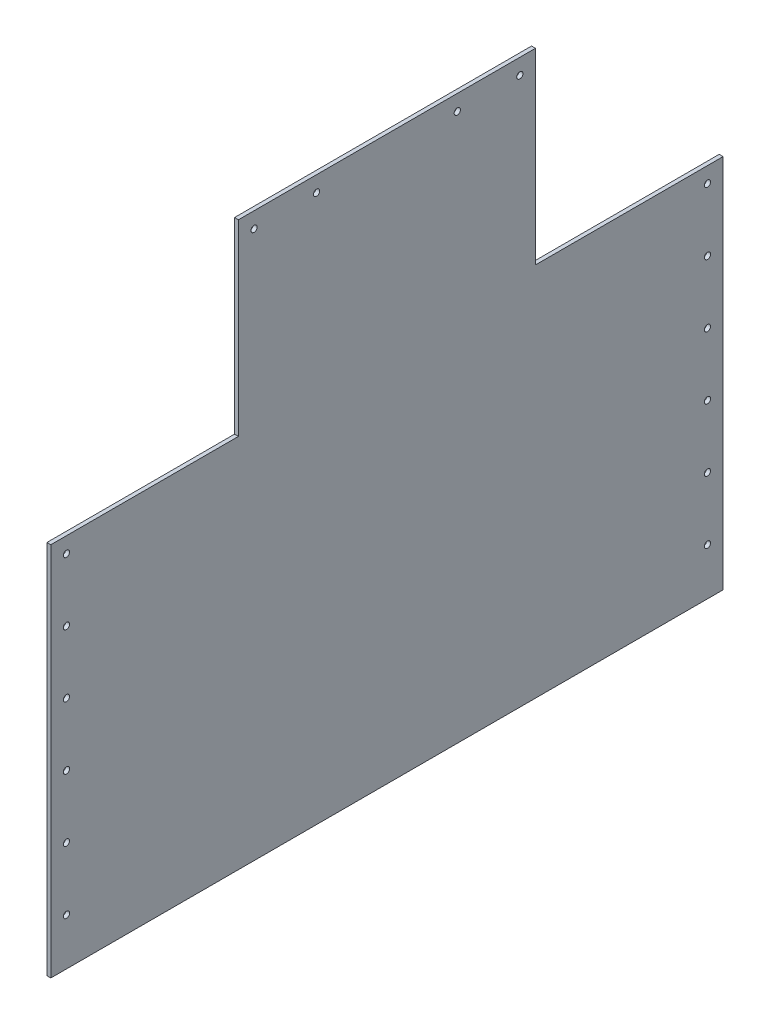
ISO-10303-21;
HEADER;
FILE_DESCRIPTION(('STEP AP214'),'2;1');
FILE_NAME('part.step','',(''),(''),'','','');
FILE_SCHEMA(('AUTOMOTIVE_DESIGN { 1 0 10303 214 1 1 1 1 }'));
ENDSEC;
DATA;
#1=APPLICATION_CONTEXT('core data for automotive mechanical design processes');
#2=APPLICATION_PROTOCOL_DEFINITION('international standard','automotive_design',2000,#1);
#3=PRODUCT_CONTEXT('',#1,'mechanical');
#4=PRODUCT('Part','Part','',(#3));
#5=PRODUCT_RELATED_PRODUCT_CATEGORY('part','',(#4));
#6=PRODUCT_DEFINITION_FORMATION('','',#4);
#7=PRODUCT_DEFINITION_CONTEXT('part definition',#1,'design');
#8=PRODUCT_DEFINITION('design','',#6,#7);
#9=PRODUCT_DEFINITION_SHAPE('','',#8);
#10=(LENGTH_UNIT() NAMED_UNIT(*) SI_UNIT(.MILLI.,.METRE.));
#11=(NAMED_UNIT(*) PLANE_ANGLE_UNIT() SI_UNIT($,.RADIAN.));
#12=(NAMED_UNIT(*) SI_UNIT($,.STERADIAN.) SOLID_ANGLE_UNIT());
#13=UNCERTAINTY_MEASURE_WITH_UNIT(LENGTH_MEASURE(1.E-05),#10,'distance_accuracy_value','');
#14=(GEOMETRIC_REPRESENTATION_CONTEXT(3) GLOBAL_UNCERTAINTY_ASSIGNED_CONTEXT((#13)) GLOBAL_UNIT_ASSIGNED_CONTEXT((#10,
#11,#12)) REPRESENTATION_CONTEXT('',''));
#15=CARTESIAN_POINT('',(0.,0.,0.));
#16=DIRECTION('',(0.,0.,1.));
#17=DIRECTION('',(1.,0.,0.));
#18=AXIS2_PLACEMENT_3D('',#15,#16,#17);
#19=CARTESIAN_POINT('',(3.175,0.,-546.1));
#20=DIRECTION('',(0.,1.,0.));
#21=DIRECTION('',(0.,0.,1.));
#22=AXIS2_PLACEMENT_3D('',#19,#20,#21);
#23=PLANE('',#22);
#24=DIRECTION('',(0.,0.,-1.));
#25=VECTOR('',#24,1.);
#26=CARTESIAN_POINT('',(0.,0.,-546.1));
#27=LINE('',#26,#25);
#28=CARTESIAN_POINT('',(0.,0.,0.));
#29=VERTEX_POINT('',#28);
#30=CARTESIAN_POINT('',(0.,0.,-546.1));
#31=VERTEX_POINT('',#30);
#32=EDGE_CURVE('E128',#29,#31,#27,.T.);
#33=ORIENTED_EDGE('',*,*,#32,.T.);
#34=DIRECTION('',(-1.,0.,0.));
#35=VECTOR('',#34,1.);
#36=CARTESIAN_POINT('',(3.175,0.,-546.1));
#37=LINE('',#36,#35);
#38=CARTESIAN_POINT('',(3.175,0.,-546.1));
#39=VERTEX_POINT('',#38);
#40=EDGE_CURVE('E11',#39,#31,#37,.T.);
#41=ORIENTED_EDGE('',*,*,#40,.F.);
#42=DIRECTION('',(0.,0.,-1.));
#43=VECTOR('',#42,1.);
#44=CARTESIAN_POINT('',(3.175,0.,-546.1));
#45=LINE('',#44,#43);
#46=CARTESIAN_POINT('',(3.175,0.,0.));
#47=VERTEX_POINT('',#46);
#48=EDGE_CURVE('E130',#47,#39,#45,.T.);
#49=ORIENTED_EDGE('',*,*,#48,.F.);
#50=DIRECTION('',(-1.,0.,0.));
#51=VECTOR('',#50,1.);
#52=CARTESIAN_POINT('',(3.175,0.,0.));
#53=LINE('',#52,#51);
#54=EDGE_CURVE('E47',#47,#29,#53,.T.);
#55=ORIENTED_EDGE('',*,*,#54,.T.);
#56=EDGE_LOOP('',(#33,#41,#49,#55));
#57=FACE_BOUND('',#56,.T.);
#58=ADVANCED_FACE('F39',(#57),#23,.F.);
#59=CARTESIAN_POINT('',(3.175,457.2,-546.1));
#60=DIRECTION('',(0.,0.,1.));
#61=DIRECTION('',(0.,-1.,0.));
#62=AXIS2_PLACEMENT_3D('',#59,#60,#61);
#63=PLANE('',#62);
#64=DIRECTION('',(0.,1.,0.));
#65=VECTOR('',#64,1.);
#66=CARTESIAN_POINT('',(0.,457.2,-546.1));
#67=LINE('',#66,#65);
#68=CARTESIAN_POINT('',(0.,304.8,-546.1));
#69=VERTEX_POINT('',#68);
#70=EDGE_CURVE('E139',#31,#69,#67,.T.);
#71=ORIENTED_EDGE('',*,*,#70,.T.);
#72=DIRECTION('',(1.,0.,0.));
#73=VECTOR('',#72,1.);
#74=CARTESIAN_POINT('',(0.,304.8,-546.1));
#75=LINE('',#74,#73);
#76=CARTESIAN_POINT('',(3.175,304.8,-546.1));
#77=VERTEX_POINT('',#76);
#78=EDGE_CURVE('E161',#69,#77,#75,.T.);
#79=ORIENTED_EDGE('',*,*,#78,.T.);
#80=DIRECTION('',(0.,1.,0.));
#81=VECTOR('',#80,1.);
#82=CARTESIAN_POINT('',(3.175,457.2,-546.1));
#83=LINE('',#82,#81);
#84=EDGE_CURVE('E136',#39,#77,#83,.T.);
#85=ORIENTED_EDGE('',*,*,#84,.F.);
#86=ORIENTED_EDGE('',*,*,#40,.T.);
#87=EDGE_LOOP('',(#71,#79,#85,#86));
#88=FACE_BOUND('',#87,.T.);
#89=ADVANCED_FACE('F160',(#88),#63,.F.);
#90=CARTESIAN_POINT('',(3.175,457.2,0.));
#91=DIRECTION('',(0.,-1.,0.));
#92=DIRECTION('',(0.,0.,-1.));
#93=AXIS2_PLACEMENT_3D('',#90,#91,#92);
#94=PLANE('',#93);
#95=DIRECTION('',(0.,0.,1.));
#96=VECTOR('',#95,1.);
#97=CARTESIAN_POINT('',(0.,457.2,0.));
#98=LINE('',#97,#96);
#99=CARTESIAN_POINT('',(0.,457.2,-393.7));
#100=VERTEX_POINT('',#99);
#101=CARTESIAN_POINT('',(0.,457.2,-152.4));
#102=VERTEX_POINT('',#101);
#103=EDGE_CURVE('E131',#100,#102,#98,.T.);
#104=ORIENTED_EDGE('',*,*,#103,.T.);
#105=DIRECTION('',(1.,0.,0.));
#106=VECTOR('',#105,1.);
#107=CARTESIAN_POINT('',(0.,457.2,-152.4));
#108=LINE('',#107,#106);
#109=CARTESIAN_POINT('',(3.175,457.2,-152.4));
#110=VERTEX_POINT('',#109);
#111=EDGE_CURVE('E221',#102,#110,#108,.T.);
#112=ORIENTED_EDGE('',*,*,#111,.T.);
#113=DIRECTION('',(0.,0.,1.));
#114=VECTOR('',#113,1.);
#115=CARTESIAN_POINT('',(3.175,457.2,0.));
#116=LINE('',#115,#114);
#117=CARTESIAN_POINT('',(3.175,457.2,-393.7));
#118=VERTEX_POINT('',#117);
#119=EDGE_CURVE('E146',#118,#110,#116,.T.);
#120=ORIENTED_EDGE('',*,*,#119,.F.);
#121=DIRECTION('',(1.,0.,0.));
#122=VECTOR('',#121,1.);
#123=CARTESIAN_POINT('',(0.,457.2,-393.7));
#124=LINE('',#123,#122);
#125=EDGE_CURVE('E168',#100,#118,#124,.T.);
#126=ORIENTED_EDGE('',*,*,#125,.F.);
#127=EDGE_LOOP('',(#104,#112,#120,#126));
#128=FACE_BOUND('',#127,.T.);
#129=ADVANCED_FACE('F323',(#128),#94,.F.);
#130=CARTESIAN_POINT('',(3.175,0.,0.));
#131=DIRECTION('',(0.,0.,-1.));
#132=DIRECTION('',(-1.,0.,0.));
#133=AXIS2_PLACEMENT_3D('',#130,#131,#132);
#134=PLANE('',#133);
#135=DIRECTION('',(0.,-1.,0.));
#136=VECTOR('',#135,1.);
#137=CARTESIAN_POINT('',(3.175,0.,0.));
#138=LINE('',#137,#136);
#139=CARTESIAN_POINT('',(3.175,304.8,0.));
#140=VERTEX_POINT('',#139);
#141=EDGE_CURVE('E121',#140,#47,#138,.T.);
#142=ORIENTED_EDGE('',*,*,#141,.F.);
#143=DIRECTION('',(1.,0.,0.));
#144=VECTOR('',#143,1.);
#145=CARTESIAN_POINT('',(0.,304.8,0.));
#146=LINE('',#145,#144);
#147=CARTESIAN_POINT('',(0.,304.8,0.));
#148=VERTEX_POINT('',#147);
#149=EDGE_CURVE('E107',#148,#140,#146,.T.);
#150=ORIENTED_EDGE('',*,*,#149,.F.);
#151=DIRECTION('',(0.,-1.,0.));
#152=VECTOR('',#151,1.);
#153=CARTESIAN_POINT('',(0.,0.,0.));
#154=LINE('',#153,#152);
#155=EDGE_CURVE('E119',#148,#29,#154,.T.);
#156=ORIENTED_EDGE('',*,*,#155,.T.);
#157=ORIENTED_EDGE('',*,*,#54,.F.);
#158=EDGE_LOOP('',(#142,#150,#156,#157));
#159=FACE_BOUND('',#158,.T.);
#160=ADVANCED_FACE('F117',(#159),#134,.F.);
#161=CARTESIAN_POINT('',(3.175,0.,0.));
#162=DIRECTION('',(-1.,0.,0.));
#163=DIRECTION('',(0.,0.,1.));
#164=AXIS2_PLACEMENT_3D('',#161,#162,#163);
#165=PLANE('',#164);
#166=CARTESIAN_POINT('',(3.175,444.5,-165.1));
#167=DIRECTION('',(1.,0.,0.));
#168=DIRECTION('',(0.,0.,-1.));
#169=AXIS2_PLACEMENT_3D('',#166,#167,#168);
#170=CIRCLE('',#169,2.54000000000001);
#171=CARTESIAN_POINT('',(3.175,444.5,-167.64));
#172=VERTEX_POINT('',#171);
#173=EDGE_CURVE('E225',#172,#172,#170,.T.);
#174=ORIENTED_EDGE('',*,*,#173,.F.);
#175=EDGE_LOOP('',(#174));
#176=FACE_BOUND('',#175,.T.);
#177=CARTESIAN_POINT('',(3.175,444.5,-215.9));
#178=DIRECTION('',(1.,0.,0.));
#179=DIRECTION('',(0.,0.,-1.));
#180=AXIS2_PLACEMENT_3D('',#177,#178,#179);
#181=CIRCLE('',#180,2.54000000000001);
#182=CARTESIAN_POINT('',(3.175,444.5,-218.44));
#183=VERTEX_POINT('',#182);
#184=EDGE_CURVE('E233',#183,#183,#181,.T.);
#185=ORIENTED_EDGE('',*,*,#184,.F.);
#186=EDGE_LOOP('',(#185));
#187=FACE_BOUND('',#186,.T.);
#188=CARTESIAN_POINT('',(3.175,292.1,-12.7));
#189=DIRECTION('',(1.,0.,0.));
#190=DIRECTION('',(0.,0.,-1.));
#191=AXIS2_PLACEMENT_3D('',#188,#189,#190);
#192=CIRCLE('',#191,2.54000000000001);
#193=CARTESIAN_POINT('',(3.175,292.1,-15.24));
#194=VERTEX_POINT('',#193);
#195=EDGE_CURVE('E241',#194,#194,#192,.T.);
#196=ORIENTED_EDGE('',*,*,#195,.F.);
#197=EDGE_LOOP('',(#196));
#198=FACE_BOUND('',#197,.T.);
#199=CARTESIAN_POINT('',(3.175,241.3,-12.7));
#200=DIRECTION('',(1.,0.,0.));
#201=DIRECTION('',(0.,0.,-1.));
#202=AXIS2_PLACEMENT_3D('',#199,#200,#201);
#203=CIRCLE('',#202,2.54000000000001);
#204=CARTESIAN_POINT('',(3.175,241.3,-15.24));
#205=VERTEX_POINT('',#204);
#206=EDGE_CURVE('E249',#205,#205,#203,.T.);
#207=ORIENTED_EDGE('',*,*,#206,.F.);
#208=EDGE_LOOP('',(#207));
#209=FACE_BOUND('',#208,.T.);
#210=CARTESIAN_POINT('',(3.175,190.5,-12.7));
#211=DIRECTION('',(1.,0.,0.));
#212=DIRECTION('',(0.,0.,-1.));
#213=AXIS2_PLACEMENT_3D('',#210,#211,#212);
#214=CIRCLE('',#213,2.54000000000001);
#215=CARTESIAN_POINT('',(3.175,190.5,-15.24));
#216=VERTEX_POINT('',#215);
#217=EDGE_CURVE('E257',#216,#216,#214,.T.);
#218=ORIENTED_EDGE('',*,*,#217,.F.);
#219=EDGE_LOOP('',(#218));
#220=FACE_BOUND('',#219,.T.);
#221=CARTESIAN_POINT('',(3.175,139.7,-12.7));
#222=DIRECTION('',(1.,0.,0.));
#223=DIRECTION('',(0.,0.,-1.));
#224=AXIS2_PLACEMENT_3D('',#221,#222,#223);
#225=CIRCLE('',#224,2.54000000000001);
#226=CARTESIAN_POINT('',(3.175,139.7,-15.24));
#227=VERTEX_POINT('',#226);
#228=EDGE_CURVE('E265',#227,#227,#225,.T.);
#229=ORIENTED_EDGE('',*,*,#228,.F.);
#230=EDGE_LOOP('',(#229));
#231=FACE_BOUND('',#230,.T.);
#232=CARTESIAN_POINT('',(3.175,88.9,-12.7));
#233=DIRECTION('',(1.,0.,0.));
#234=DIRECTION('',(0.,0.,-1.));
#235=AXIS2_PLACEMENT_3D('',#232,#233,#234);
#236=CIRCLE('',#235,2.54000000000001);
#237=CARTESIAN_POINT('',(3.175,88.9,-15.24));
#238=VERTEX_POINT('',#237);
#239=EDGE_CURVE('E273',#238,#238,#236,.T.);
#240=ORIENTED_EDGE('',*,*,#239,.F.);
#241=EDGE_LOOP('',(#240));
#242=FACE_BOUND('',#241,.T.);
#243=CARTESIAN_POINT('',(3.175,38.1,-12.7));
#244=DIRECTION('',(1.,0.,0.));
#245=DIRECTION('',(0.,0.,-1.));
#246=AXIS2_PLACEMENT_3D('',#243,#244,#245);
#247=CIRCLE('',#246,2.54000000000001);
#248=CARTESIAN_POINT('',(3.175,38.1,-15.24));
#249=VERTEX_POINT('',#248);
#250=EDGE_CURVE('E281',#249,#249,#247,.T.);
#251=ORIENTED_EDGE('',*,*,#250,.F.);
#252=EDGE_LOOP('',(#251));
#253=FACE_BOUND('',#252,.T.);
#254=CARTESIAN_POINT('',(3.175,38.1000000000004,-533.4));
#255=DIRECTION('',(1.,0.,0.));
#256=DIRECTION('',(0.,0.,1.));
#257=AXIS2_PLACEMENT_3D('',#254,#255,#256);
#258=CIRCLE('',#257,2.54000000000006);
#259=CARTESIAN_POINT('',(3.175,38.1000000000004,-530.86));
#260=VERTEX_POINT('',#259);
#261=EDGE_CURVE('E289',#260,#260,#258,.T.);
#262=ORIENTED_EDGE('',*,*,#261,.F.);
#263=EDGE_LOOP('',(#262));
#264=FACE_BOUND('',#263,.T.);
#265=CARTESIAN_POINT('',(3.175,88.9000000000004,-533.4));
#266=DIRECTION('',(1.,0.,0.));
#267=DIRECTION('',(0.,0.,1.));
#268=AXIS2_PLACEMENT_3D('',#265,#266,#267);
#269=CIRCLE('',#268,2.54000000000006);
#270=CARTESIAN_POINT('',(3.175,88.9000000000004,-530.86));
#271=VERTEX_POINT('',#270);
#272=EDGE_CURVE('E297',#271,#271,#269,.T.);
#273=ORIENTED_EDGE('',*,*,#272,.F.);
#274=EDGE_LOOP('',(#273));
#275=FACE_BOUND('',#274,.T.);
#276=CARTESIAN_POINT('',(3.175,139.7,-533.4));
#277=DIRECTION('',(1.,0.,0.));
#278=DIRECTION('',(0.,0.,1.));
#279=AXIS2_PLACEMENT_3D('',#276,#277,#278);
#280=CIRCLE('',#279,2.54000000000006);
#281=CARTESIAN_POINT('',(3.175,139.7,-530.86));
#282=VERTEX_POINT('',#281);
#283=EDGE_CURVE('E305',#282,#282,#280,.T.);
#284=ORIENTED_EDGE('',*,*,#283,.F.);
#285=EDGE_LOOP('',(#284));
#286=FACE_BOUND('',#285,.T.);
#287=CARTESIAN_POINT('',(3.175,190.5,-533.4));
#288=DIRECTION('',(1.,0.,0.));
#289=DIRECTION('',(0.,0.,1.));
#290=AXIS2_PLACEMENT_3D('',#287,#288,#289);
#291=CIRCLE('',#290,2.54000000000006);
#292=CARTESIAN_POINT('',(3.175,190.5,-530.86));
#293=VERTEX_POINT('',#292);
#294=EDGE_CURVE('E192',#293,#293,#291,.T.);
#295=ORIENTED_EDGE('',*,*,#294,.F.);
#296=EDGE_LOOP('',(#295));
#297=FACE_BOUND('',#296,.T.);
#298=CARTESIAN_POINT('',(3.175,444.5,-381.));
#299=DIRECTION('',(1.,0.,0.));
#300=DIRECTION('',(0.,0.,1.));
#301=AXIS2_PLACEMENT_3D('',#298,#299,#300);
#302=CIRCLE('',#301,2.54000000000001);
#303=CARTESIAN_POINT('',(3.175,444.5,-378.46));
#304=VERTEX_POINT('',#303);
#305=EDGE_CURVE('E217',#304,#304,#302,.T.);
#306=ORIENTED_EDGE('',*,*,#305,.F.);
#307=EDGE_LOOP('',(#306));
#308=FACE_BOUND('',#307,.T.);
#309=CARTESIAN_POINT('',(3.175,444.5,-330.2));
#310=DIRECTION('',(1.,0.,0.));
#311=DIRECTION('',(0.,0.,1.));
#312=AXIS2_PLACEMENT_3D('',#309,#310,#311);
#313=CIRCLE('',#312,2.54000000000001);
#314=CARTESIAN_POINT('',(3.175,444.5,-327.66));
#315=VERTEX_POINT('',#314);
#316=EDGE_CURVE('E209',#315,#315,#313,.T.);
#317=ORIENTED_EDGE('',*,*,#316,.F.);
#318=EDGE_LOOP('',(#317));
#319=FACE_BOUND('',#318,.T.);
#320=CARTESIAN_POINT('',(3.175,292.1,-533.4));
#321=DIRECTION('',(1.,0.,0.));
#322=DIRECTION('',(0.,0.,1.));
#323=AXIS2_PLACEMENT_3D('',#320,#321,#322);
#324=CIRCLE('',#323,2.54000000000006);
#325=CARTESIAN_POINT('',(3.175,292.1,-530.86));
#326=VERTEX_POINT('',#325);
#327=EDGE_CURVE('E201',#326,#326,#324,.T.);
#328=ORIENTED_EDGE('',*,*,#327,.F.);
#329=EDGE_LOOP('',(#328));
#330=FACE_BOUND('',#329,.T.);
#331=CARTESIAN_POINT('',(3.175,241.3,-533.4));
#332=DIRECTION('',(1.,0.,0.));
#333=DIRECTION('',(0.,0.,1.));
#334=AXIS2_PLACEMENT_3D('',#331,#332,#333);
#335=CIRCLE('',#334,2.54000000000006);
#336=CARTESIAN_POINT('',(3.175,241.3,-530.86));
#337=VERTEX_POINT('',#336);
#338=EDGE_CURVE('E193',#337,#337,#335,.T.);
#339=ORIENTED_EDGE('',*,*,#338,.F.);
#340=EDGE_LOOP('',(#339));
#341=FACE_BOUND('',#340,.T.);
#342=ORIENTED_EDGE('',*,*,#119,.T.);
#343=DIRECTION('',(0.,1.,0.));
#344=VECTOR('',#343,1.);
#345=CARTESIAN_POINT('',(3.175,457.2,-152.4));
#346=LINE('',#345,#344);
#347=CARTESIAN_POINT('',(3.175,304.8,-152.4));
#348=VERTEX_POINT('',#347);
#349=EDGE_CURVE('E113',#348,#110,#346,.T.);
#350=ORIENTED_EDGE('',*,*,#349,.F.);
#351=DIRECTION('',(0.,0.,-1.));
#352=VECTOR('',#351,1.);
#353=CARTESIAN_POINT('',(3.175,304.8,0.));
#354=LINE('',#353,#352);
#355=EDGE_CURVE('E185',#140,#348,#354,.T.);
#356=ORIENTED_EDGE('',*,*,#355,.F.);
#357=ORIENTED_EDGE('',*,*,#141,.T.);
#358=ORIENTED_EDGE('',*,*,#48,.T.);
#359=ORIENTED_EDGE('',*,*,#84,.T.);
#360=DIRECTION('',(0.,0.,-1.));
#361=VECTOR('',#360,1.);
#362=CARTESIAN_POINT('',(3.175,304.8,-546.1));
#363=LINE('',#362,#361);
#364=CARTESIAN_POINT('',(3.175,304.8,-393.7));
#365=VERTEX_POINT('',#364);
#366=EDGE_CURVE('E174',#365,#77,#363,.T.);
#367=ORIENTED_EDGE('',*,*,#366,.F.);
#368=DIRECTION('',(0.,-1.,0.));
#369=VECTOR('',#368,1.);
#370=CARTESIAN_POINT('',(3.175,457.2,-393.7));
#371=LINE('',#370,#369);
#372=EDGE_CURVE('E177',#118,#365,#371,.T.);
#373=ORIENTED_EDGE('',*,*,#372,.F.);
#374=EDGE_LOOP('',(#342,#350,#356,#357,#358,#359,#367,#373));
#375=FACE_BOUND('',#374,.T.);
#376=ADVANCED_FACE('F317',(#176,#187,#198,#209,#220,#231,#242,#253,#264,#275,#286,#297,#308,
#319,#330,#341,#375),#165,.F.);
#377=CARTESIAN_POINT('',(0.,0.,0.));
#378=DIRECTION('',(-1.,0.,0.));
#379=DIRECTION('',(0.,0.,1.));
#380=AXIS2_PLACEMENT_3D('',#377,#378,#379);
#381=PLANE('',#380);
#382=DIRECTION('',(0.,1.,0.));
#383=VECTOR('',#382,1.);
#384=CARTESIAN_POINT('',(0.,457.2,-152.4));
#385=LINE('',#384,#383);
#386=CARTESIAN_POINT('',(0.,304.8,-152.4));
#387=VERTEX_POINT('',#386);
#388=EDGE_CURVE('E54',#387,#102,#385,.T.);
#389=ORIENTED_EDGE('',*,*,#388,.T.);
#390=ORIENTED_EDGE('',*,*,#103,.F.);
#391=DIRECTION('',(0.,-1.,0.));
#392=VECTOR('',#391,1.);
#393=CARTESIAN_POINT('',(0.,457.2,-393.7));
#394=LINE('',#393,#392);
#395=CARTESIAN_POINT('',(0.,304.8,-393.7));
#396=VERTEX_POINT('',#395);
#397=EDGE_CURVE('E166',#100,#396,#394,.T.);
#398=ORIENTED_EDGE('',*,*,#397,.T.);
#399=DIRECTION('',(0.,0.,-1.));
#400=VECTOR('',#399,1.);
#401=CARTESIAN_POINT('',(0.,304.8,-546.1));
#402=LINE('',#401,#400);
#403=EDGE_CURVE('E62',#396,#69,#402,.T.);
#404=ORIENTED_EDGE('',*,*,#403,.T.);
#405=ORIENTED_EDGE('',*,*,#70,.F.);
#406=ORIENTED_EDGE('',*,*,#32,.F.);
#407=ORIENTED_EDGE('',*,*,#155,.F.);
#408=DIRECTION('',(0.,0.,-1.));
#409=VECTOR('',#408,1.);
#410=CARTESIAN_POINT('',(0.,304.8,0.));
#411=LINE('',#410,#409);
#412=EDGE_CURVE('E103',#148,#387,#411,.T.);
#413=ORIENTED_EDGE('',*,*,#412,.T.);
#414=EDGE_LOOP('',(#389,#390,#398,#404,#405,#406,#407,#413));
#415=FACE_BOUND('',#414,.T.);
#416=CARTESIAN_POINT('',(0.,444.5,-165.1));
#417=DIRECTION('',(1.,0.,0.));
#418=DIRECTION('',(0.,0.,-1.));
#419=AXIS2_PLACEMENT_3D('',#416,#417,#418);
#420=CIRCLE('',#419,2.54000000000001);
#421=CARTESIAN_POINT('',(0.,444.5,-167.64));
#422=VERTEX_POINT('',#421);
#423=EDGE_CURVE('E155',#422,#422,#420,.T.);
#424=ORIENTED_EDGE('',*,*,#423,.T.);
#425=EDGE_LOOP('',(#424));
#426=FACE_BOUND('',#425,.T.);
#427=CARTESIAN_POINT('',(0.,444.5,-215.9));
#428=DIRECTION('',(1.,0.,0.));
#429=DIRECTION('',(0.,0.,-1.));
#430=AXIS2_PLACEMENT_3D('',#427,#428,#429);
#431=CIRCLE('',#430,2.54000000000001);
#432=CARTESIAN_POINT('',(0.,444.5,-218.44));
#433=VERTEX_POINT('',#432);
#434=EDGE_CURVE('E229',#433,#433,#431,.T.);
#435=ORIENTED_EDGE('',*,*,#434,.T.);
#436=EDGE_LOOP('',(#435));
#437=FACE_BOUND('',#436,.T.);
#438=CARTESIAN_POINT('',(0.,292.1,-12.7));
#439=DIRECTION('',(1.,0.,0.));
#440=DIRECTION('',(0.,0.,-1.));
#441=AXIS2_PLACEMENT_3D('',#438,#439,#440);
#442=CIRCLE('',#441,2.54000000000001);
#443=CARTESIAN_POINT('',(0.,292.1,-15.24));
#444=VERTEX_POINT('',#443);
#445=EDGE_CURVE('E237',#444,#444,#442,.T.);
#446=ORIENTED_EDGE('',*,*,#445,.T.);
#447=EDGE_LOOP('',(#446));
#448=FACE_BOUND('',#447,.T.);
#449=CARTESIAN_POINT('',(0.,241.3,-12.7));
#450=DIRECTION('',(1.,0.,0.));
#451=DIRECTION('',(0.,0.,-1.));
#452=AXIS2_PLACEMENT_3D('',#449,#450,#451);
#453=CIRCLE('',#452,2.54000000000001);
#454=CARTESIAN_POINT('',(0.,241.3,-15.24));
#455=VERTEX_POINT('',#454);
#456=EDGE_CURVE('E245',#455,#455,#453,.T.);
#457=ORIENTED_EDGE('',*,*,#456,.T.);
#458=EDGE_LOOP('',(#457));
#459=FACE_BOUND('',#458,.T.);
#460=CARTESIAN_POINT('',(0.,190.5,-12.7));
#461=DIRECTION('',(1.,0.,0.));
#462=DIRECTION('',(0.,0.,-1.));
#463=AXIS2_PLACEMENT_3D('',#460,#461,#462);
#464=CIRCLE('',#463,2.54000000000001);
#465=CARTESIAN_POINT('',(0.,190.5,-15.24));
#466=VERTEX_POINT('',#465);
#467=EDGE_CURVE('E253',#466,#466,#464,.T.);
#468=ORIENTED_EDGE('',*,*,#467,.T.);
#469=EDGE_LOOP('',(#468));
#470=FACE_BOUND('',#469,.T.);
#471=CARTESIAN_POINT('',(0.,139.7,-12.7));
#472=DIRECTION('',(1.,0.,0.));
#473=DIRECTION('',(0.,0.,-1.));
#474=AXIS2_PLACEMENT_3D('',#471,#472,#473);
#475=CIRCLE('',#474,2.54000000000001);
#476=CARTESIAN_POINT('',(0.,139.7,-15.24));
#477=VERTEX_POINT('',#476);
#478=EDGE_CURVE('E261',#477,#477,#475,.T.);
#479=ORIENTED_EDGE('',*,*,#478,.T.);
#480=EDGE_LOOP('',(#479));
#481=FACE_BOUND('',#480,.T.);
#482=CARTESIAN_POINT('',(0.,88.9,-12.7));
#483=DIRECTION('',(1.,0.,0.));
#484=DIRECTION('',(0.,0.,-1.));
#485=AXIS2_PLACEMENT_3D('',#482,#483,#484);
#486=CIRCLE('',#485,2.54000000000001);
#487=CARTESIAN_POINT('',(0.,88.9,-15.24));
#488=VERTEX_POINT('',#487);
#489=EDGE_CURVE('E269',#488,#488,#486,.T.);
#490=ORIENTED_EDGE('',*,*,#489,.T.);
#491=EDGE_LOOP('',(#490));
#492=FACE_BOUND('',#491,.T.);
#493=CARTESIAN_POINT('',(0.,38.1,-12.7));
#494=DIRECTION('',(1.,0.,0.));
#495=DIRECTION('',(0.,0.,-1.));
#496=AXIS2_PLACEMENT_3D('',#493,#494,#495);
#497=CIRCLE('',#496,2.54000000000001);
#498=CARTESIAN_POINT('',(0.,38.1,-15.24));
#499=VERTEX_POINT('',#498);
#500=EDGE_CURVE('E277',#499,#499,#497,.T.);
#501=ORIENTED_EDGE('',*,*,#500,.T.);
#502=EDGE_LOOP('',(#501));
#503=FACE_BOUND('',#502,.T.);
#504=CARTESIAN_POINT('',(0.,38.1000000000004,-533.4));
#505=DIRECTION('',(1.,0.,0.));
#506=DIRECTION('',(0.,0.,1.));
#507=AXIS2_PLACEMENT_3D('',#504,#505,#506);
#508=CIRCLE('',#507,2.54000000000006);
#509=CARTESIAN_POINT('',(0.,38.1000000000004,-530.86));
#510=VERTEX_POINT('',#509);
#511=EDGE_CURVE('E285',#510,#510,#508,.T.);
#512=ORIENTED_EDGE('',*,*,#511,.T.);
#513=EDGE_LOOP('',(#512));
#514=FACE_BOUND('',#513,.T.);
#515=CARTESIAN_POINT('',(0.,88.9000000000004,-533.4));
#516=DIRECTION('',(1.,0.,0.));
#517=DIRECTION('',(0.,0.,1.));
#518=AXIS2_PLACEMENT_3D('',#515,#516,#517);
#519=CIRCLE('',#518,2.54000000000006);
#520=CARTESIAN_POINT('',(0.,88.9000000000004,-530.86));
#521=VERTEX_POINT('',#520);
#522=EDGE_CURVE('E293',#521,#521,#519,.T.);
#523=ORIENTED_EDGE('',*,*,#522,.T.);
#524=EDGE_LOOP('',(#523));
#525=FACE_BOUND('',#524,.T.);
#526=CARTESIAN_POINT('',(0.,139.7,-533.4));
#527=DIRECTION('',(1.,0.,0.));
#528=DIRECTION('',(0.,0.,1.));
#529=AXIS2_PLACEMENT_3D('',#526,#527,#528);
#530=CIRCLE('',#529,2.54000000000006);
#531=CARTESIAN_POINT('',(0.,139.7,-530.86));
#532=VERTEX_POINT('',#531);
#533=EDGE_CURVE('E301',#532,#532,#530,.T.);
#534=ORIENTED_EDGE('',*,*,#533,.T.);
#535=EDGE_LOOP('',(#534));
#536=FACE_BOUND('',#535,.T.);
#537=CARTESIAN_POINT('',(0.,190.5,-533.4));
#538=DIRECTION('',(1.,0.,0.));
#539=DIRECTION('',(0.,0.,1.));
#540=AXIS2_PLACEMENT_3D('',#537,#538,#539);
#541=CIRCLE('',#540,2.54000000000006);
#542=CARTESIAN_POINT('',(0.,190.5,-530.86));
#543=VERTEX_POINT('',#542);
#544=EDGE_CURVE('E309',#543,#543,#541,.T.);
#545=ORIENTED_EDGE('',*,*,#544,.T.);
#546=EDGE_LOOP('',(#545));
#547=FACE_BOUND('',#546,.T.);
#548=CARTESIAN_POINT('',(0.,444.5,-381.));
#549=DIRECTION('',(1.,0.,0.));
#550=DIRECTION('',(0.,0.,1.));
#551=AXIS2_PLACEMENT_3D('',#548,#549,#550);
#552=CIRCLE('',#551,2.54000000000001);
#553=CARTESIAN_POINT('',(0.,444.5,-378.46));
#554=VERTEX_POINT('',#553);
#555=EDGE_CURVE('E213',#554,#554,#552,.T.);
#556=ORIENTED_EDGE('',*,*,#555,.T.);
#557=EDGE_LOOP('',(#556));
#558=FACE_BOUND('',#557,.T.);
#559=CARTESIAN_POINT('',(0.,444.5,-330.2));
#560=DIRECTION('',(1.,0.,0.));
#561=DIRECTION('',(0.,0.,1.));
#562=AXIS2_PLACEMENT_3D('',#559,#560,#561);
#563=CIRCLE('',#562,2.54000000000001);
#564=CARTESIAN_POINT('',(0.,444.5,-327.66));
#565=VERTEX_POINT('',#564);
#566=EDGE_CURVE('E205',#565,#565,#563,.T.);
#567=ORIENTED_EDGE('',*,*,#566,.T.);
#568=EDGE_LOOP('',(#567));
#569=FACE_BOUND('',#568,.T.);
#570=CARTESIAN_POINT('',(0.,292.1,-533.4));
#571=DIRECTION('',(1.,0.,0.));
#572=DIRECTION('',(0.,0.,1.));
#573=AXIS2_PLACEMENT_3D('',#570,#571,#572);
#574=CIRCLE('',#573,2.54000000000006);
#575=CARTESIAN_POINT('',(0.,292.1,-530.86));
#576=VERTEX_POINT('',#575);
#577=EDGE_CURVE('E197',#576,#576,#574,.T.);
#578=ORIENTED_EDGE('',*,*,#577,.T.);
#579=EDGE_LOOP('',(#578));
#580=FACE_BOUND('',#579,.T.);
#581=CARTESIAN_POINT('',(0.,241.3,-533.4));
#582=DIRECTION('',(1.,0.,0.));
#583=DIRECTION('',(0.,0.,1.));
#584=AXIS2_PLACEMENT_3D('',#581,#582,#583);
#585=CIRCLE('',#584,2.54000000000006);
#586=CARTESIAN_POINT('',(0.,241.3,-530.86));
#587=VERTEX_POINT('',#586);
#588=EDGE_CURVE('E188',#587,#587,#585,.T.);
#589=ORIENTED_EDGE('',*,*,#588,.T.);
#590=EDGE_LOOP('',(#589));
#591=FACE_BOUND('',#590,.T.);
#592=ADVANCED_FACE('F125',(#415,#426,#437,#448,#459,#470,#481,#492,#503,#514,#525,#536,#547,
#558,#569,#580,#591),#381,.T.);
#593=CARTESIAN_POINT('',(0.,241.3,-533.4));
#594=DIRECTION('',(1.,0.,0.));
#595=DIRECTION('',(0.,0.,-1.));
#596=AXIS2_PLACEMENT_3D('',#593,#594,#595);
#597=CYLINDRICAL_SURFACE('',#596,2.54000000000006);
#598=ORIENTED_EDGE('',*,*,#588,.F.);
#599=EDGE_LOOP('',(#598));
#600=FACE_BOUND('',#599,.T.);
#601=ORIENTED_EDGE('',*,*,#338,.T.);
#602=EDGE_LOOP('',(#601));
#603=FACE_BOUND('',#602,.T.);
#604=ADVANCED_FACE('F334',(#600,#603),#597,.F.);
#605=CARTESIAN_POINT('',(0.,292.1,-533.4));
#606=DIRECTION('',(1.,0.,0.));
#607=DIRECTION('',(0.,0.,-1.));
#608=AXIS2_PLACEMENT_3D('',#605,#606,#607);
#609=CYLINDRICAL_SURFACE('',#608,2.54000000000006);
#610=ORIENTED_EDGE('',*,*,#577,.F.);
#611=EDGE_LOOP('',(#610));
#612=FACE_BOUND('',#611,.T.);
#613=ORIENTED_EDGE('',*,*,#327,.T.);
#614=EDGE_LOOP('',(#613));
#615=FACE_BOUND('',#614,.T.);
#616=ADVANCED_FACE('F394',(#612,#615),#609,.F.);
#617=CARTESIAN_POINT('',(0.,444.5,-330.2));
#618=DIRECTION('',(1.,0.,0.));
#619=DIRECTION('',(0.,0.,-1.));
#620=AXIS2_PLACEMENT_3D('',#617,#618,#619);
#621=CYLINDRICAL_SURFACE('',#620,2.54000000000001);
#622=ORIENTED_EDGE('',*,*,#566,.F.);
#623=EDGE_LOOP('',(#622));
#624=FACE_BOUND('',#623,.T.);
#625=ORIENTED_EDGE('',*,*,#316,.T.);
#626=EDGE_LOOP('',(#625));
#627=FACE_BOUND('',#626,.T.);
#628=ADVANCED_FACE('F390',(#624,#627),#621,.F.);
#629=CARTESIAN_POINT('',(0.,444.5,-381.));
#630=DIRECTION('',(1.,0.,0.));
#631=DIRECTION('',(0.,0.,-1.));
#632=AXIS2_PLACEMENT_3D('',#629,#630,#631);
#633=CYLINDRICAL_SURFACE('',#632,2.54000000000001);
#634=ORIENTED_EDGE('',*,*,#555,.F.);
#635=EDGE_LOOP('',(#634));
#636=FACE_BOUND('',#635,.T.);
#637=ORIENTED_EDGE('',*,*,#305,.T.);
#638=EDGE_LOOP('',(#637));
#639=FACE_BOUND('',#638,.T.);
#640=ADVANCED_FACE('F342',(#636,#639),#633,.F.);
#641=CARTESIAN_POINT('',(0.,190.5,-533.4));
#642=DIRECTION('',(1.,0.,0.));
#643=DIRECTION('',(0.,0.,-1.));
#644=AXIS2_PLACEMENT_3D('',#641,#642,#643);
#645=CYLINDRICAL_SURFACE('',#644,2.54000000000006);
#646=ORIENTED_EDGE('',*,*,#544,.F.);
#647=EDGE_LOOP('',(#646));
#648=FACE_BOUND('',#647,.T.);
#649=ORIENTED_EDGE('',*,*,#294,.T.);
#650=EDGE_LOOP('',(#649));
#651=FACE_BOUND('',#650,.T.);
#652=ADVANCED_FACE('F338',(#648,#651),#645,.F.);
#653=CARTESIAN_POINT('',(0.,139.7,-533.4));
#654=DIRECTION('',(1.,0.,0.));
#655=DIRECTION('',(0.,0.,-1.));
#656=AXIS2_PLACEMENT_3D('',#653,#654,#655);
#657=CYLINDRICAL_SURFACE('',#656,2.54000000000006);
#658=ORIENTED_EDGE('',*,*,#533,.F.);
#659=EDGE_LOOP('',(#658));
#660=FACE_BOUND('',#659,.T.);
#661=ORIENTED_EDGE('',*,*,#283,.T.);
#662=EDGE_LOOP('',(#661));
#663=FACE_BOUND('',#662,.T.);
#664=ADVANCED_FACE('F341',(#660,#663),#657,.F.);
#665=CARTESIAN_POINT('',(0.,88.9000000000004,-533.4));
#666=DIRECTION('',(1.,0.,0.));
#667=DIRECTION('',(0.,0.,-1.));
#668=AXIS2_PLACEMENT_3D('',#665,#666,#667);
#669=CYLINDRICAL_SURFACE('',#668,2.54000000000006);
#670=ORIENTED_EDGE('',*,*,#522,.F.);
#671=EDGE_LOOP('',(#670));
#672=FACE_BOUND('',#671,.T.);
#673=ORIENTED_EDGE('',*,*,#272,.T.);
#674=EDGE_LOOP('',(#673));
#675=FACE_BOUND('',#674,.T.);
#676=ADVANCED_FACE('F346',(#672,#675),#669,.F.);
#677=CARTESIAN_POINT('',(0.,38.1000000000004,-533.4));
#678=DIRECTION('',(1.,0.,0.));
#679=DIRECTION('',(0.,0.,-1.));
#680=AXIS2_PLACEMENT_3D('',#677,#678,#679);
#681=CYLINDRICAL_SURFACE('',#680,2.54000000000006);
#682=ORIENTED_EDGE('',*,*,#511,.F.);
#683=EDGE_LOOP('',(#682));
#684=FACE_BOUND('',#683,.T.);
#685=ORIENTED_EDGE('',*,*,#261,.T.);
#686=EDGE_LOOP('',(#685));
#687=FACE_BOUND('',#686,.T.);
#688=ADVANCED_FACE('F350',(#684,#687),#681,.F.);
#689=CARTESIAN_POINT('',(0.,38.1,-12.7));
#690=DIRECTION('',(1.,0.,0.));
#691=DIRECTION('',(0.,0.,-1.));
#692=AXIS2_PLACEMENT_3D('',#689,#690,#691);
#693=CYLINDRICAL_SURFACE('',#692,2.54000000000001);
#694=ORIENTED_EDGE('',*,*,#500,.F.);
#695=EDGE_LOOP('',(#694));
#696=FACE_BOUND('',#695,.T.);
#697=ORIENTED_EDGE('',*,*,#250,.T.);
#698=EDGE_LOOP('',(#697));
#699=FACE_BOUND('',#698,.T.);
#700=ADVANCED_FACE('F354',(#696,#699),#693,.F.);
#701=CARTESIAN_POINT('',(0.,88.9,-12.7));
#702=DIRECTION('',(1.,0.,0.));
#703=DIRECTION('',(0.,0.,-1.));
#704=AXIS2_PLACEMENT_3D('',#701,#702,#703);
#705=CYLINDRICAL_SURFACE('',#704,2.54000000000001);
#706=ORIENTED_EDGE('',*,*,#489,.F.);
#707=EDGE_LOOP('',(#706));
#708=FACE_BOUND('',#707,.T.);
#709=ORIENTED_EDGE('',*,*,#239,.T.);
#710=EDGE_LOOP('',(#709));
#711=FACE_BOUND('',#710,.T.);
#712=ADVANCED_FACE('F358',(#708,#711),#705,.F.);
#713=CARTESIAN_POINT('',(0.,139.7,-12.7));
#714=DIRECTION('',(1.,0.,0.));
#715=DIRECTION('',(0.,0.,-1.));
#716=AXIS2_PLACEMENT_3D('',#713,#714,#715);
#717=CYLINDRICAL_SURFACE('',#716,2.54000000000001);
#718=ORIENTED_EDGE('',*,*,#478,.F.);
#719=EDGE_LOOP('',(#718));
#720=FACE_BOUND('',#719,.T.);
#721=ORIENTED_EDGE('',*,*,#228,.T.);
#722=EDGE_LOOP('',(#721));
#723=FACE_BOUND('',#722,.T.);
#724=ADVANCED_FACE('F362',(#720,#723),#717,.F.);
#725=CARTESIAN_POINT('',(0.,190.5,-12.7));
#726=DIRECTION('',(1.,0.,0.));
#727=DIRECTION('',(0.,0.,-1.));
#728=AXIS2_PLACEMENT_3D('',#725,#726,#727);
#729=CYLINDRICAL_SURFACE('',#728,2.54000000000001);
#730=ORIENTED_EDGE('',*,*,#467,.F.);
#731=EDGE_LOOP('',(#730));
#732=FACE_BOUND('',#731,.T.);
#733=ORIENTED_EDGE('',*,*,#217,.T.);
#734=EDGE_LOOP('',(#733));
#735=FACE_BOUND('',#734,.T.);
#736=ADVANCED_FACE('F366',(#732,#735),#729,.F.);
#737=CARTESIAN_POINT('',(0.,241.3,-12.7));
#738=DIRECTION('',(1.,0.,0.));
#739=DIRECTION('',(0.,0.,-1.));
#740=AXIS2_PLACEMENT_3D('',#737,#738,#739);
#741=CYLINDRICAL_SURFACE('',#740,2.54000000000001);
#742=ORIENTED_EDGE('',*,*,#456,.F.);
#743=EDGE_LOOP('',(#742));
#744=FACE_BOUND('',#743,.T.);
#745=ORIENTED_EDGE('',*,*,#206,.T.);
#746=EDGE_LOOP('',(#745));
#747=FACE_BOUND('',#746,.T.);
#748=ADVANCED_FACE('F370',(#744,#747),#741,.F.);
#749=CARTESIAN_POINT('',(0.,292.1,-12.7));
#750=DIRECTION('',(1.,0.,0.));
#751=DIRECTION('',(0.,0.,-1.));
#752=AXIS2_PLACEMENT_3D('',#749,#750,#751);
#753=CYLINDRICAL_SURFACE('',#752,2.54000000000001);
#754=ORIENTED_EDGE('',*,*,#445,.F.);
#755=EDGE_LOOP('',(#754));
#756=FACE_BOUND('',#755,.T.);
#757=ORIENTED_EDGE('',*,*,#195,.T.);
#758=EDGE_LOOP('',(#757));
#759=FACE_BOUND('',#758,.T.);
#760=ADVANCED_FACE('F374',(#756,#759),#753,.F.);
#761=CARTESIAN_POINT('',(0.,444.5,-215.9));
#762=DIRECTION('',(1.,0.,0.));
#763=DIRECTION('',(0.,0.,-1.));
#764=AXIS2_PLACEMENT_3D('',#761,#762,#763);
#765=CYLINDRICAL_SURFACE('',#764,2.54000000000001);
#766=ORIENTED_EDGE('',*,*,#434,.F.);
#767=EDGE_LOOP('',(#766));
#768=FACE_BOUND('',#767,.T.);
#769=ORIENTED_EDGE('',*,*,#184,.T.);
#770=EDGE_LOOP('',(#769));
#771=FACE_BOUND('',#770,.T.);
#772=ADVANCED_FACE('F378',(#768,#771),#765,.F.);
#773=CARTESIAN_POINT('',(0.,444.5,-165.1));
#774=DIRECTION('',(1.,0.,0.));
#775=DIRECTION('',(0.,0.,-1.));
#776=AXIS2_PLACEMENT_3D('',#773,#774,#775);
#777=CYLINDRICAL_SURFACE('',#776,2.54000000000001);
#778=ORIENTED_EDGE('',*,*,#423,.F.);
#779=EDGE_LOOP('',(#778));
#780=FACE_BOUND('',#779,.T.);
#781=ORIENTED_EDGE('',*,*,#173,.T.);
#782=EDGE_LOOP('',(#781));
#783=FACE_BOUND('',#782,.T.);
#784=ADVANCED_FACE('F382',(#780,#783),#777,.F.);
#785=CARTESIAN_POINT('',(0.,304.8,-546.1));
#786=DIRECTION('',(0.,-1.,0.));
#787=DIRECTION('',(0.,0.,-1.));
#788=AXIS2_PLACEMENT_3D('',#785,#786,#787);
#789=PLANE('',#788);
#790=ORIENTED_EDGE('',*,*,#366,.T.);
#791=ORIENTED_EDGE('',*,*,#78,.F.);
#792=ORIENTED_EDGE('',*,*,#403,.F.);
#793=DIRECTION('',(1.,0.,0.));
#794=VECTOR('',#793,1.);
#795=CARTESIAN_POINT('',(0.,304.8,-393.7));
#796=LINE('',#795,#794);
#797=EDGE_CURVE('E172',#396,#365,#796,.T.);
#798=ORIENTED_EDGE('',*,*,#797,.T.);
#799=EDGE_LOOP('',(#790,#791,#792,#798));
#800=FACE_BOUND('',#799,.T.);
#801=ADVANCED_FACE('F386',(#800),#789,.F.);
#802=CARTESIAN_POINT('',(0.,457.2,-393.7));
#803=DIRECTION('',(0.,0.,1.));
#804=DIRECTION('',(1.,0.,0.));
#805=AXIS2_PLACEMENT_3D('',#802,#803,#804);
#806=PLANE('',#805);
#807=ORIENTED_EDGE('',*,*,#372,.T.);
#808=ORIENTED_EDGE('',*,*,#797,.F.);
#809=ORIENTED_EDGE('',*,*,#397,.F.);
#810=ORIENTED_EDGE('',*,*,#125,.T.);
#811=EDGE_LOOP('',(#807,#808,#809,#810));
#812=FACE_BOUND('',#811,.T.);
#813=ADVANCED_FACE('F402',(#812),#806,.F.);
#814=CARTESIAN_POINT('',(0.,457.2,-152.4));
#815=DIRECTION('',(0.,0.,-1.));
#816=DIRECTION('',(0.,1.,0.));
#817=AXIS2_PLACEMENT_3D('',#814,#815,#816);
#818=PLANE('',#817);
#819=ORIENTED_EDGE('',*,*,#349,.T.);
#820=ORIENTED_EDGE('',*,*,#111,.F.);
#821=ORIENTED_EDGE('',*,*,#388,.F.);
#822=DIRECTION('',(1.,0.,0.));
#823=VECTOR('',#822,1.);
#824=CARTESIAN_POINT('',(0.,304.8,-152.4));
#825=LINE('',#824,#823);
#826=EDGE_CURVE('E109',#387,#348,#825,.T.);
#827=ORIENTED_EDGE('',*,*,#826,.T.);
#828=EDGE_LOOP('',(#819,#820,#821,#827));
#829=FACE_BOUND('',#828,.T.);
#830=ADVANCED_FACE('F405',(#829),#818,.F.);
#831=CARTESIAN_POINT('',(0.,304.8,0.));
#832=DIRECTION('',(0.,-1.,0.));
#833=DIRECTION('',(0.,0.,-1.));
#834=AXIS2_PLACEMENT_3D('',#831,#832,#833);
#835=PLANE('',#834);
#836=ORIENTED_EDGE('',*,*,#355,.T.);
#837=ORIENTED_EDGE('',*,*,#826,.F.);
#838=ORIENTED_EDGE('',*,*,#412,.F.);
#839=ORIENTED_EDGE('',*,*,#149,.T.);
#840=EDGE_LOOP('',(#836,#837,#838,#839));
#841=FACE_BOUND('',#840,.T.);
#842=ADVANCED_FACE('F106',(#841),#835,.F.);
#843=CLOSED_SHELL('',(#58,#89,#129,#160,#376,#592,#604,#616,#628,#640,#652,#664,#676,#688,#700,
#712,#724,#736,#748,#760,#772,#784,#801,#813,#830,#842));
#844=MANIFOLD_SOLID_BREP('B2',#843);
#845=ADVANCED_BREP_SHAPE_REPRESENTATION('',(#18,#844),#14);
#846=SHAPE_DEFINITION_REPRESENTATION(#9,#845);
ENDSEC;
END-ISO-10303-21;
